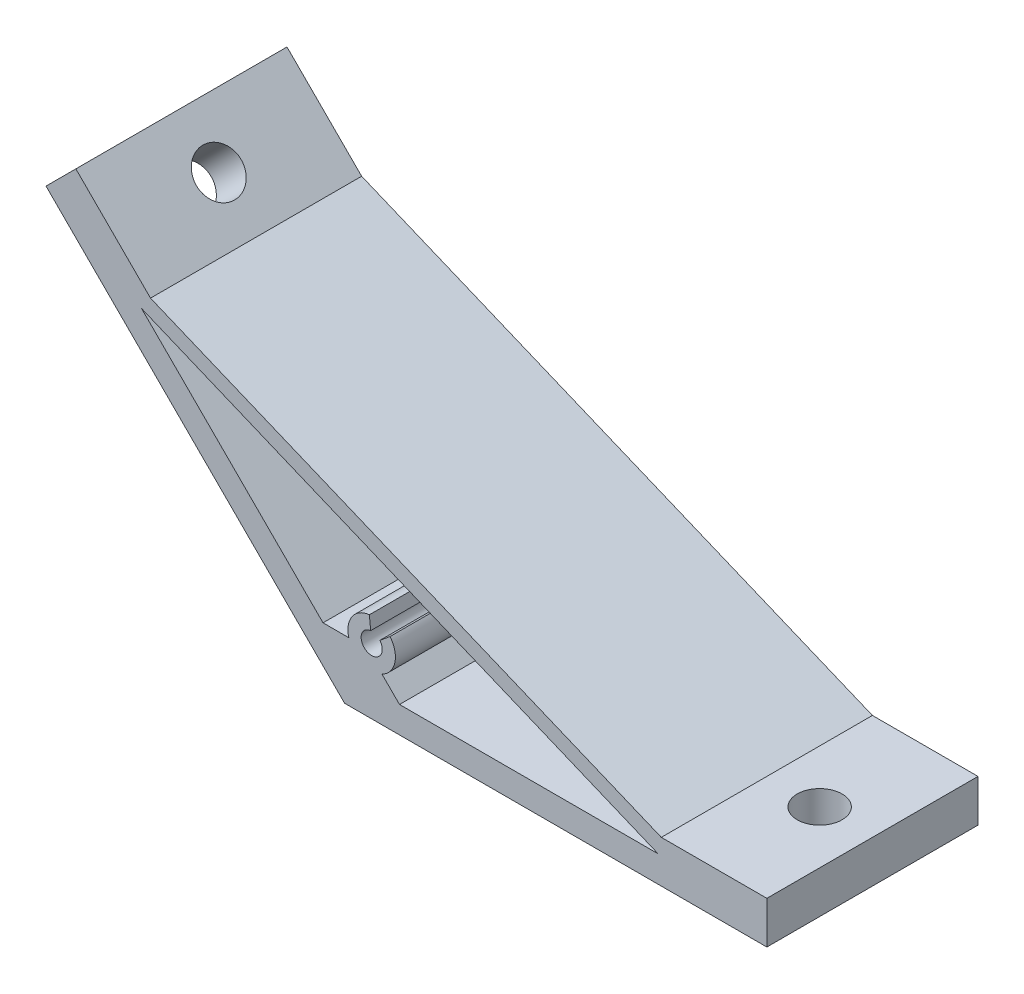
ISO-10303-21;
HEADER;
FILE_DESCRIPTION(('STEP AP214'),'2;1');
FILE_NAME('part.step','',(''),(''),'','','');
FILE_SCHEMA(('AUTOMOTIVE_DESIGN { 1 0 10303 214 1 1 1 1 }'));
ENDSEC;
DATA;
#1=APPLICATION_CONTEXT('core data for automotive mechanical design processes');
#2=APPLICATION_PROTOCOL_DEFINITION('international standard','automotive_design',2000,#1);
#3=PRODUCT_CONTEXT('',#1,'mechanical');
#4=PRODUCT('Part','Part','',(#3));
#5=PRODUCT_RELATED_PRODUCT_CATEGORY('part','',(#4));
#6=PRODUCT_DEFINITION_FORMATION('','',#4);
#7=PRODUCT_DEFINITION_CONTEXT('part definition',#1,'design');
#8=PRODUCT_DEFINITION('design','',#6,#7);
#9=PRODUCT_DEFINITION_SHAPE('','',#8);
#10=(LENGTH_UNIT() NAMED_UNIT(*) SI_UNIT(.MILLI.,.METRE.));
#11=(NAMED_UNIT(*) PLANE_ANGLE_UNIT() SI_UNIT($,.RADIAN.));
#12=(NAMED_UNIT(*) SI_UNIT($,.STERADIAN.) SOLID_ANGLE_UNIT());
#13=UNCERTAINTY_MEASURE_WITH_UNIT(LENGTH_MEASURE(1.E-05),#10,'distance_accuracy_value','');
#14=(GEOMETRIC_REPRESENTATION_CONTEXT(3) GLOBAL_UNCERTAINTY_ASSIGNED_CONTEXT((#13)) GLOBAL_UNIT_ASSIGNED_CONTEXT((#10,
#11,#12)) REPRESENTATION_CONTEXT('',''));
#15=CARTESIAN_POINT('',(0.,0.,0.));
#16=DIRECTION('',(0.,0.,1.));
#17=DIRECTION('',(1.,0.,0.));
#18=AXIS2_PLACEMENT_3D('',#15,#16,#17);
#19=CARTESIAN_POINT('',(7049.27262922413,-1279.24037910918,20.));
#20=DIRECTION('',(0.382683432365095,0.923879532511285,0.));
#21=DIRECTION('',(-0.923879532511285,0.382683432365095,0.));
#22=AXIS2_PLACEMENT_3D('',#19,#20,#21);
#23=PLANE('',#22);
#24=DIRECTION('',(0.923879532511285,-0.382683432365095,0.));
#25=VECTOR('',#24,1.);
#26=CARTESIAN_POINT('',(7049.27262922413,-1279.24037910918,-20.));
#27=LINE('',#26,#25);
#28=CARTESIAN_POINT('',(6955.91811216156,-1240.57167203307,-20.));
#29=VERTEX_POINT('',#28);
#30=CARTESIAN_POINT('',(7052.68766478326,-1280.65493315376,-20.));
#31=VERTEX_POINT('',#30);
#32=EDGE_CURVE('E234',#29,#31,#27,.T.);
#33=ORIENTED_EDGE('',*,*,#32,.F.);
#34=DIRECTION('',(0.,0.,-1.));
#35=VECTOR('',#34,1.);
#36=CARTESIAN_POINT('',(6955.91811216156,-1240.57167203307,20.));
#37=LINE('',#36,#35);
#38=CARTESIAN_POINT('',(6955.91811216156,-1240.57167203307,20.));
#39=VERTEX_POINT('',#38);
#40=EDGE_CURVE('E11',#39,#29,#37,.T.);
#41=ORIENTED_EDGE('',*,*,#40,.F.);
#42=DIRECTION('',(0.923879532511285,-0.382683432365095,0.));
#43=VECTOR('',#42,1.);
#44=CARTESIAN_POINT('',(7049.27262922413,-1279.24037910918,20.));
#45=LINE('',#44,#43);
#46=CARTESIAN_POINT('',(7052.68766478326,-1280.65493315376,20.));
#47=VERTEX_POINT('',#46);
#48=EDGE_CURVE('E270',#39,#47,#45,.T.);
#49=ORIENTED_EDGE('',*,*,#48,.T.);
#50=DIRECTION('',(0.,0.,-1.));
#51=VECTOR('',#50,1.);
#52=CARTESIAN_POINT('',(7052.68766478326,-1280.65493315376,20.));
#53=LINE('',#52,#51);
#54=EDGE_CURVE('E52',#47,#31,#53,.T.);
#55=ORIENTED_EDGE('',*,*,#54,.T.);
#56=EDGE_LOOP('',(#33,#41,#49,#55));
#57=FACE_BOUND('',#56,.T.);
#58=ADVANCED_FACE('F33',(#57),#23,.T.);
#59=CARTESIAN_POINT('',(7056.8507836413,-1341.50434351282,20.));
#60=DIRECTION('',(-0.707106781186559,-0.707106781186536,0.));
#61=DIRECTION('',(0.707106781186536,-0.707106781186559,0.));
#62=AXIS2_PLACEMENT_3D('',#59,#60,#61);
#63=PLANE('',#62);
#64=CARTESIAN_POINT('',(6948.84704434969,-1233.50060422121,0.));
#65=DIRECTION('',(-0.707106781186559,-0.707106781186536,0.));
#66=DIRECTION('',(0.707106781186536,-0.707106781186559,0.));
#67=AXIS2_PLACEMENT_3D('',#64,#65,#66);
#68=CIRCLE('',#67,4.24999999999998);
#69=CARTESIAN_POINT('',(6951.85224816974,-1236.50580804125,0.));
#70=VERTEX_POINT('',#69);
#71=EDGE_CURVE('E262',#70,#70,#68,.T.);
#72=ORIENTED_EDGE('',*,*,#71,.T.);
#73=EDGE_LOOP('',(#72));
#74=FACE_BOUND('',#73,.T.);
#75=DIRECTION('',(-0.707106781186536,0.707106781186559,0.));
#76=VECTOR('',#75,1.);
#77=CARTESIAN_POINT('',(7056.8507836413,-1341.50434351282,-20.));
#78=LINE('',#77,#76);
#79=CARTESIAN_POINT('',(6941.77597653783,-1226.42953640934,-20.));
#80=VERTEX_POINT('',#79);
#81=EDGE_CURVE('E231',#29,#80,#78,.T.);
#82=ORIENTED_EDGE('',*,*,#81,.T.);
#83=DIRECTION('',(0.,0.,-1.));
#84=VECTOR('',#83,1.);
#85=CARTESIAN_POINT('',(6941.77597653783,-1226.42953640934,20.));
#86=LINE('',#85,#84);
#87=CARTESIAN_POINT('',(6941.77597653783,-1226.42953640934,20.));
#88=VERTEX_POINT('',#87);
#89=EDGE_CURVE('E43',#88,#80,#86,.T.);
#90=ORIENTED_EDGE('',*,*,#89,.F.);
#91=DIRECTION('',(-0.707106781186536,0.707106781186559,0.));
#92=VECTOR('',#91,1.);
#93=CARTESIAN_POINT('',(7056.8507836413,-1341.50434351282,20.));
#94=LINE('',#93,#92);
#95=EDGE_CURVE('E268',#39,#88,#94,.T.);
#96=ORIENTED_EDGE('',*,*,#95,.F.);
#97=ORIENTED_EDGE('',*,*,#40,.T.);
#98=EDGE_LOOP('',(#82,#90,#96,#97));
#99=FACE_BOUND('',#98,.T.);
#100=ADVANCED_FACE('F320',(#74,#99),#63,.F.);
#101=CARTESIAN_POINT('',(6884.81198629003,-1283.39352665715,20.));
#102=DIRECTION('',(-0.707106781186561,0.707106781186534,0.));
#103=DIRECTION('',(-0.707106781186534,-0.707106781186561,0.));
#104=AXIS2_PLACEMENT_3D('',#101,#102,#103);
#105=PLANE('',#104);
#106=DIRECTION('',(0.707106781186534,0.707106781186561,0.));
#107=VECTOR('',#106,1.);
#108=CARTESIAN_POINT('',(6884.81198629003,-1283.39352665715,-20.));
#109=LINE('',#108,#107);
#110=CARTESIAN_POINT('',(6936.11912228833,-1232.08639065884,-20.));
#111=VERTEX_POINT('',#110);
#112=EDGE_CURVE('E228',#111,#80,#109,.T.);
#113=ORIENTED_EDGE('',*,*,#112,.F.);
#114=DIRECTION('',(0.,0.,-1.));
#115=VECTOR('',#114,1.);
#116=CARTESIAN_POINT('',(6936.11912228833,-1232.08639065884,20.));
#117=LINE('',#116,#115);
#118=CARTESIAN_POINT('',(6936.11912228833,-1232.08639065884,20.));
#119=VERTEX_POINT('',#118);
#120=EDGE_CURVE('E184',#119,#111,#117,.T.);
#121=ORIENTED_EDGE('',*,*,#120,.F.);
#122=DIRECTION('',(0.707106781186534,0.707106781186561,0.));
#123=VECTOR('',#122,1.);
#124=CARTESIAN_POINT('',(6884.81198629003,-1283.39352665715,20.));
#125=LINE('',#124,#123);
#126=EDGE_CURVE('E265',#119,#88,#125,.T.);
#127=ORIENTED_EDGE('',*,*,#126,.T.);
#128=ORIENTED_EDGE('',*,*,#89,.T.);
#129=EDGE_LOOP('',(#113,#121,#127,#128));
#130=FACE_BOUND('',#129,.T.);
#131=ADVANCED_FACE('F316',(#130),#105,.T.);
#132=CARTESIAN_POINT('',(7051.19392939181,-1347.16119776231,20.));
#133=DIRECTION('',(-0.707106781186532,-0.707106781186563,0.));
#134=DIRECTION('',(0.707106781186563,-0.707106781186532,0.));
#135=AXIS2_PLACEMENT_3D('',#132,#133,#134);
#136=PLANE('',#135);
#137=CARTESIAN_POINT('',(6943.1901901002,-1239.1574584707,0.));
#138=DIRECTION('',(-0.707106781186532,-0.707106781186563,0.));
#139=DIRECTION('',(0.707106781186563,-0.707106781186532,0.));
#140=AXIS2_PLACEMENT_3D('',#137,#138,#139);
#141=CIRCLE('',#140,4.24999999999999);
#142=CARTESIAN_POINT('',(6946.19539392024,-1242.16266229074,0.));
#143=VERTEX_POINT('',#142);
#144=EDGE_CURVE('E296',#143,#143,#141,.T.);
#145=ORIENTED_EDGE('',*,*,#144,.F.);
#146=EDGE_LOOP('',(#145));
#147=FACE_BOUND('',#146,.T.);
#148=DIRECTION('',(-0.707106781186563,0.707106781186532,0.));
#149=VECTOR('',#148,1.);
#150=CARTESIAN_POINT('',(7051.19392939181,-1347.16119776231,-20.));
#151=LINE('',#150,#149);
#152=CARTESIAN_POINT('',(6992.68766478326,-1288.65493315376,-20.));
#153=VERTEX_POINT('',#152);
#154=EDGE_CURVE('E225',#153,#111,#151,.T.);
#155=ORIENTED_EDGE('',*,*,#154,.F.);
#156=DIRECTION('',(0.,0.,-1.));
#157=VECTOR('',#156,1.);
#158=CARTESIAN_POINT('',(6992.68766478326,-1288.65493315376,20.));
#159=LINE('',#158,#157);
#160=CARTESIAN_POINT('',(6992.68766478326,-1288.65493315376,20.));
#161=VERTEX_POINT('',#160);
#162=EDGE_CURVE('E182',#161,#153,#159,.T.);
#163=ORIENTED_EDGE('',*,*,#162,.F.);
#164=DIRECTION('',(-0.707106781186563,0.707106781186532,0.));
#165=VECTOR('',#164,1.);
#166=CARTESIAN_POINT('',(7051.19392939181,-1347.16119776231,20.));
#167=LINE('',#166,#165);
#168=EDGE_CURVE('E176',#161,#119,#167,.T.);
#169=ORIENTED_EDGE('',*,*,#168,.T.);
#170=ORIENTED_EDGE('',*,*,#120,.T.);
#171=EDGE_LOOP('',(#155,#163,#169,#170));
#172=FACE_BOUND('',#171,.T.);
#173=ADVANCED_FACE('F309',(#147,#172),#136,.T.);
#174=CARTESIAN_POINT('',(6999.8867933935,-1288.65493315376,20.));
#175=DIRECTION('',(0.,1.,0.));
#176=DIRECTION('',(0.,0.,1.));
#177=AXIS2_PLACEMENT_3D('',#174,#175,#176);
#178=PLANE('',#177);
#179=CARTESIAN_POINT('',(7062.68766478326,-1288.65493315376,0.));
#180=DIRECTION('',(0.,-1.,0.));
#181=DIRECTION('',(0.,0.,-1.));
#182=AXIS2_PLACEMENT_3D('',#179,#180,#181);
#183=CIRCLE('',#182,4.24999999999986);
#184=CARTESIAN_POINT('',(7062.68766478326,-1288.65493315376,-4.24999999999986));
#185=VERTEX_POINT('',#184);
#186=EDGE_CURVE('E302',#185,#185,#183,.T.);
#187=ORIENTED_EDGE('',*,*,#186,.F.);
#188=EDGE_LOOP('',(#187));
#189=FACE_BOUND('',#188,.T.);
#190=DIRECTION('',(1.,0.,0.));
#191=VECTOR('',#190,1.);
#192=CARTESIAN_POINT('',(6999.8867933935,-1288.65493315376,-20.));
#193=LINE('',#192,#191);
#194=CARTESIAN_POINT('',(7072.68766478326,-1288.65493315376,-20.));
#195=VERTEX_POINT('',#194);
#196=EDGE_CURVE('E181',#153,#195,#193,.T.);
#197=ORIENTED_EDGE('',*,*,#196,.T.);
#198=DIRECTION('',(0.,0.,-1.));
#199=VECTOR('',#198,1.);
#200=CARTESIAN_POINT('',(7072.68766478326,-1288.65493315376,20.));
#201=LINE('',#200,#199);
#202=CARTESIAN_POINT('',(7072.68766478326,-1288.65493315376,20.));
#203=VERTEX_POINT('',#202);
#204=EDGE_CURVE('E163',#203,#195,#201,.T.);
#205=ORIENTED_EDGE('',*,*,#204,.F.);
#206=DIRECTION('',(1.,0.,0.));
#207=VECTOR('',#206,1.);
#208=CARTESIAN_POINT('',(6999.8867933935,-1288.65493315376,20.));
#209=LINE('',#208,#207);
#210=EDGE_CURVE('E168',#161,#203,#209,.T.);
#211=ORIENTED_EDGE('',*,*,#210,.F.);
#212=ORIENTED_EDGE('',*,*,#162,.T.);
#213=EDGE_LOOP('',(#197,#205,#211,#212));
#214=FACE_BOUND('',#213,.T.);
#215=ADVANCED_FACE('F179',(#189,#214),#178,.F.);
#216=CARTESIAN_POINT('',(7072.68766478326,-1398.46833376062,20.));
#217=DIRECTION('',(-1.,0.,0.));
#218=DIRECTION('',(0.,0.,1.));
#219=AXIS2_PLACEMENT_3D('',#216,#217,#218);
#220=PLANE('',#219);
#221=DIRECTION('',(0.,1.,0.));
#222=VECTOR('',#221,1.);
#223=CARTESIAN_POINT('',(7072.68766478326,-1398.46833376062,-20.));
#224=LINE('',#223,#222);
#225=CARTESIAN_POINT('',(7072.68766478326,-1280.65493315376,-20.));
#226=VERTEX_POINT('',#225);
#227=EDGE_CURVE('E222',#195,#226,#224,.T.);
#228=ORIENTED_EDGE('',*,*,#227,.T.);
#229=DIRECTION('',(0.,0.,-1.));
#230=VECTOR('',#229,1.);
#231=CARTESIAN_POINT('',(7072.68766478326,-1280.65493315376,20.));
#232=LINE('',#231,#230);
#233=CARTESIAN_POINT('',(7072.68766478326,-1280.65493315376,20.));
#234=VERTEX_POINT('',#233);
#235=EDGE_CURVE('E105',#234,#226,#232,.T.);
#236=ORIENTED_EDGE('',*,*,#235,.F.);
#237=DIRECTION('',(0.,1.,0.));
#238=VECTOR('',#237,1.);
#239=CARTESIAN_POINT('',(7072.68766478326,-1398.46833376062,20.));
#240=LINE('',#239,#238);
#241=EDGE_CURVE('E159',#203,#234,#240,.T.);
#242=ORIENTED_EDGE('',*,*,#241,.F.);
#243=ORIENTED_EDGE('',*,*,#204,.T.);
#244=EDGE_LOOP('',(#228,#236,#242,#243));
#245=FACE_BOUND('',#244,.T.);
#246=ADVANCED_FACE('F161',(#245),#220,.F.);
#247=CARTESIAN_POINT('',(6997.82073881189,-1276.26412007604,20.));
#248=DIRECTION('',(0.,0.,-1.));
#249=DIRECTION('',(-1.,0.,0.));
#250=AXIS2_PLACEMENT_3D('',#247,#248,#249);
#251=CYLINDRICAL_SURFACE('',#250,1.99999999999993);
#252=CARTESIAN_POINT('',(6997.82073881189,-1276.26412007604,-20.));
#253=DIRECTION('',(0.,0.,1.));
#254=DIRECTION('',(1.,0.,0.));
#255=AXIS2_PLACEMENT_3D('',#252,#253,#254);
#256=CIRCLE('',#255,1.99999999999993);
#257=CARTESIAN_POINT('',(6997.62653003943,-1274.27357167103,-20.));
#258=VERTEX_POINT('',#257);
#259=CARTESIAN_POINT('',(6999.36559542733,-1274.99391614055,-20.));
#260=VERTEX_POINT('',#259);
#261=EDGE_CURVE('E259',#258,#260,#256,.T.);
#262=ORIENTED_EDGE('',*,*,#261,.F.);
#263=DIRECTION('',(0.,0.,-1.));
#264=VECTOR('',#263,1.);
#265=CARTESIAN_POINT('',(6997.62653003943,-1274.27357167103,20.));
#266=LINE('',#265,#264);
#267=CARTESIAN_POINT('',(6997.62653003943,-1274.27357167103,20.));
#268=VERTEX_POINT('',#267);
#269=EDGE_CURVE('E37',#268,#258,#266,.T.);
#270=ORIENTED_EDGE('',*,*,#269,.F.);
#271=CARTESIAN_POINT('',(6997.82073881189,-1276.26412007604,20.));
#272=DIRECTION('',(0.,0.,1.));
#273=DIRECTION('',(1.,0.,0.));
#274=AXIS2_PLACEMENT_3D('',#271,#272,#273);
#275=CIRCLE('',#274,1.99999999999993);
#276=CARTESIAN_POINT('',(6999.36559542733,-1274.99391614055,20.));
#277=VERTEX_POINT('',#276);
#278=EDGE_CURVE('E221',#268,#277,#275,.T.);
#279=ORIENTED_EDGE('',*,*,#278,.T.);
#280=DIRECTION('',(0.,0.,-1.));
#281=VECTOR('',#280,1.);
#282=CARTESIAN_POINT('',(6999.36559542733,-1274.99391614055,20.));
#283=LINE('',#282,#281);
#284=EDGE_CURVE('E191',#277,#260,#283,.T.);
#285=ORIENTED_EDGE('',*,*,#284,.T.);
#286=EDGE_LOOP('',(#262,#270,#279,#285));
#287=FACE_BOUND('',#286,.T.);
#288=ADVANCED_FACE('F35',(#287),#251,.F.);
#289=CARTESIAN_POINT('',(7009.65070636223,-1397.51571309221,20.));
#290=DIRECTION('',(-0.9952742025064,-0.0971043862307417,0.));
#291=DIRECTION('',(0.0971043862307417,-0.9952742025064,0.));
#292=AXIS2_PLACEMENT_3D('',#289,#290,#291);
#293=PLANE('',#292);
#294=DIRECTION('',(-0.0971043862307417,0.9952742025064,0.));
#295=VECTOR('',#294,1.);
#296=CARTESIAN_POINT('',(7009.65070636223,-1397.51571309221,-20.));
#297=LINE('',#296,#295);
#298=CARTESIAN_POINT('',(6997.38376907386,-1271.78538616476,-20.));
#299=VERTEX_POINT('',#298);
#300=EDGE_CURVE('E257',#258,#299,#297,.T.);
#301=ORIENTED_EDGE('',*,*,#300,.T.);
#302=DIRECTION('',(0.,0.,-1.));
#303=VECTOR('',#302,1.);
#304=CARTESIAN_POINT('',(6997.38376907386,-1271.78538616476,20.));
#305=LINE('',#304,#303);
#306=CARTESIAN_POINT('',(6997.38376907386,-1271.78538616476,20.));
#307=VERTEX_POINT('',#306);
#308=EDGE_CURVE('E208',#307,#299,#305,.T.);
#309=ORIENTED_EDGE('',*,*,#308,.F.);
#310=DIRECTION('',(-0.0971043862307417,0.9952742025064,0.));
#311=VECTOR('',#310,1.);
#312=CARTESIAN_POINT('',(7009.65070636223,-1397.51571309221,20.));
#313=LINE('',#312,#311);
#314=EDGE_CURVE('E291',#268,#307,#313,.T.);
#315=ORIENTED_EDGE('',*,*,#314,.F.);
#316=ORIENTED_EDGE('',*,*,#269,.T.);
#317=EDGE_LOOP('',(#301,#309,#315,#316));
#318=FACE_BOUND('',#317,.T.);
#319=ADVANCED_FACE('F360',(#318),#293,.F.);
#320=CARTESIAN_POINT('',(6997.82073881189,-1276.26412007604,20.));
#321=DIRECTION('',(0.,0.,-1.));
#322=DIRECTION('',(-1.,0.,0.));
#323=AXIS2_PLACEMENT_3D('',#320,#321,#322);
#324=CYLINDRICAL_SURFACE('',#323,4.49999999999951);
#325=CARTESIAN_POINT('',(6997.82073881189,-1276.26412007604,-20.));
#326=DIRECTION('',(0.,0.,1.));
#327=DIRECTION('',(1.,0.,0.));
#328=AXIS2_PLACEMENT_3D('',#325,#326,#327);
#329=CIRCLE('',#328,4.49999999999951);
#330=CARTESIAN_POINT('',(6993.49338103034,-1277.49861374974,-20.));
#331=VERTEX_POINT('',#330);
#332=EDGE_CURVE('E255',#299,#331,#329,.T.);
#333=ORIENTED_EDGE('',*,*,#332,.T.);
#334=DIRECTION('',(0.,0.,-1.));
#335=VECTOR('',#334,1.);
#336=CARTESIAN_POINT('',(6993.49338103034,-1277.49861374974,20.));
#337=LINE('',#336,#335);
#338=CARTESIAN_POINT('',(6993.49338103034,-1277.49861374974,20.));
#339=VERTEX_POINT('',#338);
#340=EDGE_CURVE('E207',#339,#331,#337,.T.);
#341=ORIENTED_EDGE('',*,*,#340,.F.);
#342=CARTESIAN_POINT('',(6997.82073881189,-1276.26412007604,20.));
#343=DIRECTION('',(0.,0.,1.));
#344=DIRECTION('',(1.,0.,0.));
#345=AXIS2_PLACEMENT_3D('',#342,#343,#344);
#346=CIRCLE('',#345,4.49999999999951);
#347=EDGE_CURVE('E289',#307,#339,#346,.T.);
#348=ORIENTED_EDGE('',*,*,#347,.F.);
#349=ORIENTED_EDGE('',*,*,#308,.T.);
#350=EDGE_LOOP('',(#333,#341,#348,#349));
#351=FACE_BOUND('',#350,.T.);
#352=ADVANCED_FACE('F357',(#351),#324,.T.);
#353=CARTESIAN_POINT('',(6999.88679339339,-1277.49861374973,20.));
#354=DIRECTION('',(-9.079781843749E-13,1.,0.));
#355=DIRECTION('',(-1.,-9.079781843749E-13,0.));
#356=AXIS2_PLACEMENT_3D('',#353,#354,#355);
#357=PLANE('',#356);
#358=DIRECTION('',(1.,9.079781843749E-13,0.));
#359=VECTOR('',#358,1.);
#360=CARTESIAN_POINT('',(6999.88679339339,-1277.49861374973,-20.));
#361=LINE('',#360,#359);
#362=CARTESIAN_POINT('',(6988.60241319111,-1277.49861374974,-20.));
#363=VERTEX_POINT('',#362);
#364=EDGE_CURVE('E252',#363,#331,#361,.T.);
#365=ORIENTED_EDGE('',*,*,#364,.F.);
#366=DIRECTION('',(0.,0.,-1.));
#367=VECTOR('',#366,1.);
#368=CARTESIAN_POINT('',(6988.60241319111,-1277.49861374974,20.));
#369=LINE('',#368,#367);
#370=CARTESIAN_POINT('',(6988.60241319111,-1277.49861374974,20.));
#371=VERTEX_POINT('',#370);
#372=EDGE_CURVE('E205',#371,#363,#369,.T.);
#373=ORIENTED_EDGE('',*,*,#372,.F.);
#374=DIRECTION('',(1.,9.079781843749E-13,0.));
#375=VECTOR('',#374,1.);
#376=CARTESIAN_POINT('',(6999.88679339339,-1277.49861374973,20.));
#377=LINE('',#376,#375);
#378=EDGE_CURVE('E286',#371,#339,#377,.T.);
#379=ORIENTED_EDGE('',*,*,#378,.T.);
#380=ORIENTED_EDGE('',*,*,#340,.T.);
#381=EDGE_LOOP('',(#365,#373,#379,#380));
#382=FACE_BOUND('',#381,.T.);
#383=ADVANCED_FACE('F353',(#382),#357,.T.);
#384=CARTESIAN_POINT('',(7054.72946329774,-1343.62566385638,20.));
#385=DIRECTION('',(-0.707106781186552,-0.707106781186543,0.));
#386=DIRECTION('',(0.707106781186543,-0.707106781186552,0.));
#387=AXIS2_PLACEMENT_3D('',#384,#385,#386);
#388=PLANE('',#387);
#389=DIRECTION('',(-0.707106781186543,0.707106781186552,0.));
#390=VECTOR('',#389,1.);
#391=CARTESIAN_POINT('',(7054.72946329774,-1343.62566385638,-20.));
#392=LINE('',#391,#390);
#393=CARTESIAN_POINT('',(6954.2187486695,-1243.11494922814,-20.));
#394=VERTEX_POINT('',#393);
#395=EDGE_CURVE('E250',#363,#394,#392,.T.);
#396=ORIENTED_EDGE('',*,*,#395,.T.);
#397=DIRECTION('',(0.,0.,-1.));
#398=VECTOR('',#397,1.);
#399=CARTESIAN_POINT('',(6954.2187486695,-1243.11494922814,20.));
#400=LINE('',#399,#398);
#401=CARTESIAN_POINT('',(6954.2187486695,-1243.11494922814,20.));
#402=VERTEX_POINT('',#401);
#403=EDGE_CURVE('E202',#402,#394,#400,.T.);
#404=ORIENTED_EDGE('',*,*,#403,.F.);
#405=DIRECTION('',(-0.707106781186543,0.707106781186552,0.));
#406=VECTOR('',#405,1.);
#407=CARTESIAN_POINT('',(7054.72946329774,-1343.62566385638,20.));
#408=LINE('',#407,#406);
#409=EDGE_CURVE('E284',#371,#402,#408,.T.);
#410=ORIENTED_EDGE('',*,*,#409,.F.);
#411=ORIENTED_EDGE('',*,*,#372,.T.);
#412=EDGE_LOOP('',(#396,#404,#410,#411));
#413=FACE_BOUND('',#412,.T.);
#414=ADVANCED_FACE('F349',(#413),#388,.F.);
#415=CARTESIAN_POINT('',(7048.12457892704,-1282.01201770672,20.));
#416=DIRECTION('',(0.3826834323651,0.923879532511283,0.));
#417=DIRECTION('',(-0.923879532511283,0.3826834323651,0.));
#418=AXIS2_PLACEMENT_3D('',#415,#416,#417);
#419=PLANE('',#418);
#420=DIRECTION('',(0.923879532511283,-0.3826834323651,0.));
#421=VECTOR('',#420,1.);
#422=CARTESIAN_POINT('',(7048.12457892704,-1282.01201770672,-20.));
#423=LINE('',#422,#421);
#424=CARTESIAN_POINT('',(7052.09092768112,-1283.65493315376,-20.));
#425=VERTEX_POINT('',#424);
#426=EDGE_CURVE('E247',#394,#425,#423,.T.);
#427=ORIENTED_EDGE('',*,*,#426,.T.);
#428=DIRECTION('',(0.,0.,-1.));
#429=VECTOR('',#428,1.);
#430=CARTESIAN_POINT('',(7052.09092768112,-1283.65493315376,20.));
#431=LINE('',#430,#429);
#432=CARTESIAN_POINT('',(7052.09092768112,-1283.65493315376,20.));
#433=VERTEX_POINT('',#432);
#434=EDGE_CURVE('E200',#433,#425,#431,.T.);
#435=ORIENTED_EDGE('',*,*,#434,.F.);
#436=DIRECTION('',(0.923879532511283,-0.3826834323651,0.));
#437=VECTOR('',#436,1.);
#438=CARTESIAN_POINT('',(7048.12457892704,-1282.01201770672,20.));
#439=LINE('',#438,#437);
#440=EDGE_CURVE('E282',#402,#433,#439,.T.);
#441=ORIENTED_EDGE('',*,*,#440,.F.);
#442=ORIENTED_EDGE('',*,*,#403,.T.);
#443=EDGE_LOOP('',(#427,#435,#441,#442));
#444=FACE_BOUND('',#443,.T.);
#445=ADVANCED_FACE('F345',(#444),#419,.F.);
#446=CARTESIAN_POINT('',(6999.8867933935,-1283.65493315376,20.));
#447=DIRECTION('',(0.,1.,0.));
#448=DIRECTION('',(-1.,0.,0.));
#449=AXIS2_PLACEMENT_3D('',#446,#447,#448);
#450=PLANE('',#449);
#451=DIRECTION('',(1.,0.,0.));
#452=VECTOR('',#451,1.);
#453=CARTESIAN_POINT('',(6999.8867933935,-1283.65493315376,-20.));
#454=LINE('',#453,#452);
#455=CARTESIAN_POINT('',(7003.09092768112,-1283.65493315376,-20.));
#456=VERTEX_POINT('',#455);
#457=EDGE_CURVE('E244',#456,#425,#454,.T.);
#458=ORIENTED_EDGE('',*,*,#457,.F.);
#459=DIRECTION('',(0.,0.,-1.));
#460=VECTOR('',#459,1.);
#461=CARTESIAN_POINT('',(7003.09092768112,-1283.65493315376,20.));
#462=LINE('',#461,#460);
#463=CARTESIAN_POINT('',(7003.09092768112,-1283.65493315376,20.));
#464=VERTEX_POINT('',#463);
#465=EDGE_CURVE('E198',#464,#456,#462,.T.);
#466=ORIENTED_EDGE('',*,*,#465,.F.);
#467=DIRECTION('',(1.,0.,0.));
#468=VECTOR('',#467,1.);
#469=CARTESIAN_POINT('',(6999.8867933935,-1283.65493315376,20.));
#470=LINE('',#469,#468);
#471=EDGE_CURVE('E279',#464,#433,#470,.T.);
#472=ORIENTED_EDGE('',*,*,#471,.T.);
#473=ORIENTED_EDGE('',*,*,#434,.T.);
#474=EDGE_LOOP('',(#458,#466,#472,#473));
#475=FACE_BOUND('',#474,.T.);
#476=ADVANCED_FACE('F341',(#475),#450,.T.);
#477=CARTESIAN_POINT('',(7058.89556084074,-1339.4595663134,20.));
#478=DIRECTION('',(-0.707106781186689,-0.707106781186406,0.));
#479=DIRECTION('',(0.707106781186406,-0.707106781186689,0.));
#480=AXIS2_PLACEMENT_3D('',#477,#478,#479);
#481=PLANE('',#480);
#482=DIRECTION('',(-0.707106781186406,0.707106781186689,0.));
#483=VECTOR('',#482,1.);
#484=CARTESIAN_POINT('',(7058.89556084074,-1339.4595663134,-20.));
#485=LINE('',#484,#483);
#486=CARTESIAN_POINT('',(6999.76054974539,-1280.32455521803,-20.));
#487=VERTEX_POINT('',#486);
#488=EDGE_CURVE('E242',#456,#487,#485,.T.);
#489=ORIENTED_EDGE('',*,*,#488,.T.);
#490=DIRECTION('',(0.,0.,-1.));
#491=VECTOR('',#490,1.);
#492=CARTESIAN_POINT('',(6999.76054974539,-1280.32455521803,20.));
#493=LINE('',#492,#491);
#494=CARTESIAN_POINT('',(6999.76054974539,-1280.32455521803,20.));
#495=VERTEX_POINT('',#494);
#496=EDGE_CURVE('E195',#495,#487,#493,.T.);
#497=ORIENTED_EDGE('',*,*,#496,.F.);
#498=DIRECTION('',(-0.707106781186406,0.707106781186689,0.));
#499=VECTOR('',#498,1.);
#500=CARTESIAN_POINT('',(7058.89556084074,-1339.4595663134,20.));
#501=LINE('',#500,#499);
#502=EDGE_CURVE('E277',#464,#495,#501,.T.);
#503=ORIENTED_EDGE('',*,*,#502,.F.);
#504=ORIENTED_EDGE('',*,*,#465,.T.);
#505=EDGE_LOOP('',(#489,#497,#503,#504));
#506=FACE_BOUND('',#505,.T.);
#507=ADVANCED_FACE('F337',(#506),#481,.F.);
#508=CARTESIAN_POINT('',(6997.82073881189,-1276.26412007604,20.));
#509=DIRECTION('',(0.,0.,-1.));
#510=DIRECTION('',(-1.,0.,0.));
#511=AXIS2_PLACEMENT_3D('',#508,#509,#510);
#512=CYLINDRICAL_SURFACE('',#511,4.50000000000019);
#513=CARTESIAN_POINT('',(6997.82073881189,-1276.26412007604,-20.));
#514=DIRECTION('',(0.,0.,1.));
#515=DIRECTION('',(1.,0.,0.));
#516=AXIS2_PLACEMENT_3D('',#513,#514,#515);
#517=CIRCLE('',#516,4.50000000000019);
#518=CARTESIAN_POINT('',(7001.29666619663,-1273.40616122118,-20.));
#519=VERTEX_POINT('',#518);
#520=EDGE_CURVE('E239',#487,#519,#517,.T.);
#521=ORIENTED_EDGE('',*,*,#520,.T.);
#522=DIRECTION('',(0.,0.,-1.));
#523=VECTOR('',#522,1.);
#524=CARTESIAN_POINT('',(7001.29666619663,-1273.40616122118,20.));
#525=LINE('',#524,#523);
#526=CARTESIAN_POINT('',(7001.29666619663,-1273.40616122118,20.));
#527=VERTEX_POINT('',#526);
#528=EDGE_CURVE('E193',#527,#519,#525,.T.);
#529=ORIENTED_EDGE('',*,*,#528,.F.);
#530=CARTESIAN_POINT('',(6997.82073881189,-1276.26412007604,20.));
#531=DIRECTION('',(0.,0.,1.));
#532=DIRECTION('',(1.,0.,0.));
#533=AXIS2_PLACEMENT_3D('',#530,#531,#532);
#534=CIRCLE('',#533,4.50000000000019);
#535=EDGE_CURVE('E275',#495,#527,#534,.T.);
#536=ORIENTED_EDGE('',*,*,#535,.F.);
#537=ORIENTED_EDGE('',*,*,#496,.T.);
#538=EDGE_LOOP('',(#521,#529,#536,#537));
#539=FACE_BOUND('',#538,.T.);
#540=ADVANCED_FACE('F333',(#539),#512,.T.);
#541=CARTESIAN_POINT('',(6939.10362964596,-1324.54219481639,20.));
#542=DIRECTION('',(-0.63510196774562,0.772428307719002,0.));
#543=DIRECTION('',(-0.772428307719002,-0.63510196774562,0.));
#544=AXIS2_PLACEMENT_3D('',#541,#542,#543);
#545=PLANE('',#544);
#546=DIRECTION('',(0.772428307719002,0.63510196774562,0.));
#547=VECTOR('',#546,1.);
#548=CARTESIAN_POINT('',(6939.10362964596,-1324.54219481639,-20.));
#549=LINE('',#548,#547);
#550=EDGE_CURVE('E236',#260,#519,#549,.T.);
#551=ORIENTED_EDGE('',*,*,#550,.F.);
#552=ORIENTED_EDGE('',*,*,#284,.F.);
#553=DIRECTION('',(0.772428307719002,0.63510196774562,0.));
#554=VECTOR('',#553,1.);
#555=CARTESIAN_POINT('',(6939.10362964596,-1324.54219481639,20.));
#556=LINE('',#555,#554);
#557=EDGE_CURVE('E272',#277,#527,#556,.T.);
#558=ORIENTED_EDGE('',*,*,#557,.T.);
#559=ORIENTED_EDGE('',*,*,#528,.T.);
#560=EDGE_LOOP('',(#551,#552,#558,#559));
#561=FACE_BOUND('',#560,.T.);
#562=ADVANCED_FACE('F329',(#561),#545,.T.);
#563=CARTESIAN_POINT('',(6999.8867933935,-1280.65493315376,20.));
#564=DIRECTION('',(0.,1.,0.));
#565=DIRECTION('',(0.,0.,1.));
#566=AXIS2_PLACEMENT_3D('',#563,#564,#565);
#567=PLANE('',#566);
#568=CARTESIAN_POINT('',(7062.68766478326,-1280.65493315376,0.));
#569=DIRECTION('',(0.,1.,0.));
#570=DIRECTION('',(0.,0.,1.));
#571=AXIS2_PLACEMENT_3D('',#568,#569,#570);
#572=CIRCLE('',#571,4.24999999999986);
#573=CARTESIAN_POINT('',(7062.68766478326,-1280.65493315376,4.24999999999986));
#574=VERTEX_POINT('',#573);
#575=EDGE_CURVE('E299',#574,#574,#572,.T.);
#576=ORIENTED_EDGE('',*,*,#575,.F.);
#577=EDGE_LOOP('',(#576));
#578=FACE_BOUND('',#577,.T.);
#579=DIRECTION('',(1.,0.,0.));
#580=VECTOR('',#579,1.);
#581=CARTESIAN_POINT('',(6999.8867933935,-1280.65493315376,-20.));
#582=LINE('',#581,#580);
#583=EDGE_CURVE('E218',#31,#226,#582,.T.);
#584=ORIENTED_EDGE('',*,*,#583,.F.);
#585=ORIENTED_EDGE('',*,*,#54,.F.);
#586=DIRECTION('',(1.,0.,0.));
#587=VECTOR('',#586,1.);
#588=CARTESIAN_POINT('',(6999.8867933935,-1280.65493315376,20.));
#589=LINE('',#588,#587);
#590=EDGE_CURVE('E167',#47,#234,#589,.T.);
#591=ORIENTED_EDGE('',*,*,#590,.T.);
#592=ORIENTED_EDGE('',*,*,#235,.T.);
#593=EDGE_LOOP('',(#584,#585,#591,#592));
#594=FACE_BOUND('',#593,.T.);
#595=ADVANCED_FACE('F332',(#578,#594),#567,.T.);
#596=CARTESIAN_POINT('',(6999.8867933935,-1398.46833376062,20.));
#597=DIRECTION('',(0.,0.,1.));
#598=DIRECTION('',(1.,0.,0.));
#599=AXIS2_PLACEMENT_3D('',#596,#597,#598);
#600=PLANE('',#599);
#601=ORIENTED_EDGE('',*,*,#278,.F.);
#602=ORIENTED_EDGE('',*,*,#314,.T.);
#603=ORIENTED_EDGE('',*,*,#347,.T.);
#604=ORIENTED_EDGE('',*,*,#378,.F.);
#605=ORIENTED_EDGE('',*,*,#409,.T.);
#606=ORIENTED_EDGE('',*,*,#440,.T.);
#607=ORIENTED_EDGE('',*,*,#471,.F.);
#608=ORIENTED_EDGE('',*,*,#502,.T.);
#609=ORIENTED_EDGE('',*,*,#535,.T.);
#610=ORIENTED_EDGE('',*,*,#557,.F.);
#611=EDGE_LOOP('',(#601,#602,#603,#604,#605,#606,#607,#608,#609,#610));
#612=FACE_BOUND('',#611,.T.);
#613=ORIENTED_EDGE('',*,*,#48,.F.);
#614=ORIENTED_EDGE('',*,*,#95,.T.);
#615=ORIENTED_EDGE('',*,*,#126,.F.);
#616=ORIENTED_EDGE('',*,*,#168,.F.);
#617=ORIENTED_EDGE('',*,*,#210,.T.);
#618=ORIENTED_EDGE('',*,*,#241,.T.);
#619=ORIENTED_EDGE('',*,*,#590,.F.);
#620=EDGE_LOOP('',(#613,#614,#615,#616,#617,#618,#619));
#621=FACE_BOUND('',#620,.T.);
#622=ADVANCED_FACE('F173',(#612,#621),#600,.T.);
#623=CARTESIAN_POINT('',(6999.8867933935,-1398.46833376062,-20.));
#624=DIRECTION('',(0.,0.,1.));
#625=DIRECTION('',(1.,0.,0.));
#626=AXIS2_PLACEMENT_3D('',#623,#624,#625);
#627=PLANE('',#626);
#628=ORIENTED_EDGE('',*,*,#261,.T.);
#629=ORIENTED_EDGE('',*,*,#550,.T.);
#630=ORIENTED_EDGE('',*,*,#520,.F.);
#631=ORIENTED_EDGE('',*,*,#488,.F.);
#632=ORIENTED_EDGE('',*,*,#457,.T.);
#633=ORIENTED_EDGE('',*,*,#426,.F.);
#634=ORIENTED_EDGE('',*,*,#395,.F.);
#635=ORIENTED_EDGE('',*,*,#364,.T.);
#636=ORIENTED_EDGE('',*,*,#332,.F.);
#637=ORIENTED_EDGE('',*,*,#300,.F.);
#638=EDGE_LOOP('',(#628,#629,#630,#631,#632,#633,#634,#635,#636,#637));
#639=FACE_BOUND('',#638,.T.);
#640=ORIENTED_EDGE('',*,*,#32,.T.);
#641=ORIENTED_EDGE('',*,*,#583,.T.);
#642=ORIENTED_EDGE('',*,*,#227,.F.);
#643=ORIENTED_EDGE('',*,*,#196,.F.);
#644=ORIENTED_EDGE('',*,*,#154,.T.);
#645=ORIENTED_EDGE('',*,*,#112,.T.);
#646=ORIENTED_EDGE('',*,*,#81,.F.);
#647=EDGE_LOOP('',(#640,#641,#642,#643,#644,#645,#646));
#648=FACE_BOUND('',#647,.T.);
#649=ADVANCED_FACE('F366',(#639,#648),#627,.F.);
#650=CARTESIAN_POINT('',(6943.1901901002,-1239.1574584707,0.));
#651=DIRECTION('',(-0.707106781186532,-0.707106781186563,0.));
#652=DIRECTION('',(0.707106781186563,-0.707106781186532,0.));
#653=AXIS2_PLACEMENT_3D('',#650,#651,#652);
#654=CYLINDRICAL_SURFACE('',#653,4.24999999999998);
#655=ORIENTED_EDGE('',*,*,#144,.T.);
#656=EDGE_LOOP('',(#655));
#657=FACE_BOUND('',#656,.T.);
#658=ORIENTED_EDGE('',*,*,#71,.F.);
#659=EDGE_LOOP('',(#658));
#660=FACE_BOUND('',#659,.T.);
#661=ADVANCED_FACE('F395',(#657,#660),#654,.F.);
#662=CARTESIAN_POINT('',(7062.68766478326,-1288.65493315376,0.));
#663=DIRECTION('',(0.,-1.,0.));
#664=DIRECTION('',(0.,0.,-1.));
#665=AXIS2_PLACEMENT_3D('',#662,#663,#664);
#666=CYLINDRICAL_SURFACE('',#665,4.24999999999986);
#667=ORIENTED_EDGE('',*,*,#575,.T.);
#668=EDGE_LOOP('',(#667));
#669=FACE_BOUND('',#668,.T.);
#670=ORIENTED_EDGE('',*,*,#186,.T.);
#671=EDGE_LOOP('',(#670));
#672=FACE_BOUND('',#671,.T.);
#673=ADVANCED_FACE('F306',(#669,#672),#666,.F.);
#674=CLOSED_SHELL('',(#58,#100,#131,#173,#215,#246,#288,#319,#352,#383,#414,#445,#476,#507,#540,
#562,#595,#622,#649,#661,#673));
#675=MANIFOLD_SOLID_BREP('B2',#674);
#676=ADVANCED_BREP_SHAPE_REPRESENTATION('',(#18,#675),#14);
#677=SHAPE_DEFINITION_REPRESENTATION(#9,#676);
ENDSEC;
END-ISO-10303-21;
